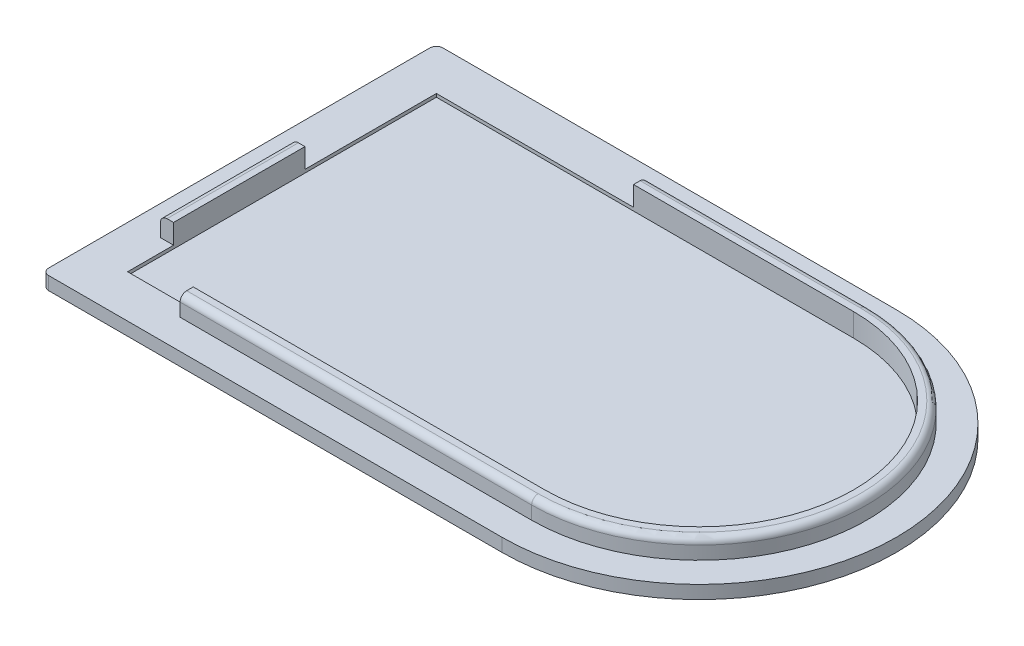
ISO-10303-21;
HEADER;
FILE_DESCRIPTION(('STEP AP214'),'2;1');
FILE_NAME('part.step','',(''),(''),'','','');
FILE_SCHEMA(('AUTOMOTIVE_DESIGN { 1 0 10303 214 1 1 1 1 }'));
ENDSEC;
DATA;
#1=APPLICATION_CONTEXT('core data for automotive mechanical design processes');
#2=APPLICATION_PROTOCOL_DEFINITION('international standard','automotive_design',2000,#1);
#3=PRODUCT_CONTEXT('',#1,'mechanical');
#4=PRODUCT('Part','Part','',(#3));
#5=PRODUCT_RELATED_PRODUCT_CATEGORY('part','',(#4));
#6=PRODUCT_DEFINITION_FORMATION('','',#4);
#7=PRODUCT_DEFINITION_CONTEXT('part definition',#1,'design');
#8=PRODUCT_DEFINITION('design','',#6,#7);
#9=PRODUCT_DEFINITION_SHAPE('','',#8);
#10=(LENGTH_UNIT() NAMED_UNIT(*) SI_UNIT(.MILLI.,.METRE.));
#11=(NAMED_UNIT(*) PLANE_ANGLE_UNIT() SI_UNIT($,.RADIAN.));
#12=(NAMED_UNIT(*) SI_UNIT($,.STERADIAN.) SOLID_ANGLE_UNIT());
#13=UNCERTAINTY_MEASURE_WITH_UNIT(LENGTH_MEASURE(1.E-05),#10,'distance_accuracy_value','');
#14=(GEOMETRIC_REPRESENTATION_CONTEXT(3) GLOBAL_UNCERTAINTY_ASSIGNED_CONTEXT((#13)) GLOBAL_UNIT_ASSIGNED_CONTEXT((#10,
#11,#12)) REPRESENTATION_CONTEXT('',''));
#15=CARTESIAN_POINT('',(0.,0.,0.));
#16=DIRECTION('',(0.,0.,1.));
#17=DIRECTION('',(1.,0.,0.));
#18=AXIS2_PLACEMENT_3D('',#15,#16,#17);
#19=CARTESIAN_POINT('',(0.,3.,-25.5));
#20=DIRECTION('',(0.,0.,1.));
#21=DIRECTION('',(1.,0.,0.));
#22=AXIS2_PLACEMENT_3D('',#19,#20,#21);
#23=PLANE('',#22);
#24=DIRECTION('',(0.,1.,0.));
#25=VECTOR('',#24,1.);
#26=CARTESIAN_POINT('',(-33.5,-38.8329756778952,-25.5));
#27=LINE('',#26,#25);
#28=CARTESIAN_POINT('',(-33.5,0.,-25.5));
#29=VERTEX_POINT('',#28);
#30=CARTESIAN_POINT('',(-33.5,2.,-25.5));
#31=VERTEX_POINT('',#30);
#32=EDGE_CURVE('E359',#29,#31,#27,.T.);
#33=ORIENTED_EDGE('',*,*,#32,.T.);
#34=DIRECTION('',(-1.,0.,0.));
#35=VECTOR('',#34,1.);
#36=CARTESIAN_POINT('',(0.,2.,-25.5));
#37=LINE('',#36,#35);
#38=CARTESIAN_POINT('',(0.,2.,-25.5));
#39=VERTEX_POINT('',#38);
#40=EDGE_CURVE('E339',#31,#39,#37,.F.);
#41=ORIENTED_EDGE('',*,*,#40,.T.);
#42=DIRECTION('',(0.,-1.,0.));
#43=VECTOR('',#42,1.);
#44=CARTESIAN_POINT('',(0.,3.,-25.5));
#45=LINE('',#44,#43);
#46=CARTESIAN_POINT('',(0.,0.,-25.5));
#47=VERTEX_POINT('',#46);
#48=EDGE_CURVE('E254',#39,#47,#45,.T.);
#49=ORIENTED_EDGE('',*,*,#48,.T.);
#50=DIRECTION('',(-1.,0.,0.));
#51=VECTOR('',#50,1.);
#52=CARTESIAN_POINT('',(0.,0.,-25.5));
#53=LINE('',#52,#51);
#54=EDGE_CURVE('E255',#47,#29,#53,.T.);
#55=ORIENTED_EDGE('',*,*,#54,.T.);
#56=EDGE_LOOP('',(#33,#41,#49,#55));
#57=FACE_BOUND('',#56,.T.);
#58=ADVANCED_FACE('F64',(#57),#23,.F.);
#59=CARTESIAN_POINT('',(-65.5,3.,0.));
#60=DIRECTION('',(1.,0.,0.));
#61=DIRECTION('',(0.,0.,-1.));
#62=AXIS2_PLACEMENT_3D('',#59,#60,#61);
#63=PLANE('',#62);
#64=DIRECTION('',(0.,1.,0.));
#65=VECTOR('',#64,1.);
#66=CARTESIAN_POINT('',(-65.5,-38.8329756778952,16.5));
#67=LINE('',#66,#65);
#68=CARTESIAN_POINT('',(-65.5,0.,16.5));
#69=VERTEX_POINT('',#68);
#70=CARTESIAN_POINT('',(-65.5,2.,16.5));
#71=VERTEX_POINT('',#70);
#72=EDGE_CURVE('E221',#69,#71,#67,.T.);
#73=ORIENTED_EDGE('',*,*,#72,.T.);
#74=DIRECTION('',(0.,0.,1.));
#75=VECTOR('',#74,1.);
#76=CARTESIAN_POINT('',(-65.5,2.,-3.49999999999999));
#77=LINE('',#76,#75);
#78=CARTESIAN_POINT('',(-65.5,2.,-3.49999999999999));
#79=VERTEX_POINT('',#78);
#80=EDGE_CURVE('E320',#71,#79,#77,.F.);
#81=ORIENTED_EDGE('',*,*,#80,.T.);
#82=DIRECTION('',(0.,1.,0.));
#83=VECTOR('',#82,1.);
#84=CARTESIAN_POINT('',(-65.5,-38.8329756778952,-3.49999999999999));
#85=LINE('',#84,#83);
#86=CARTESIAN_POINT('',(-65.5,0.,-3.49999999999999));
#87=VERTEX_POINT('',#86);
#88=EDGE_CURVE('E252',#87,#79,#85,.T.);
#89=ORIENTED_EDGE('',*,*,#88,.F.);
#90=DIRECTION('',(0.,0.,1.));
#91=VECTOR('',#90,1.);
#92=CARTESIAN_POINT('',(-65.5,0.,0.));
#93=LINE('',#92,#91);
#94=EDGE_CURVE('E241',#87,#69,#93,.T.);
#95=ORIENTED_EDGE('',*,*,#94,.T.);
#96=EDGE_LOOP('',(#73,#81,#89,#95));
#97=FACE_BOUND('',#96,.T.);
#98=ADVANCED_FACE('F250',(#97),#63,.F.);
#99=CARTESIAN_POINT('',(0.,3.,0.));
#100=DIRECTION('',(0.,1.,0.));
#101=DIRECTION('',(0.,0.,1.));
#102=AXIS2_PLACEMENT_3D('',#99,#100,#101);
#103=PLANE('',#102);
#104=DIRECTION('',(1.,0.,0.));
#105=VECTOR('',#104,1.);
#106=CARTESIAN_POINT('',(-65.5,3.,-3.49999999999999));
#107=LINE('',#106,#105);
#108=CARTESIAN_POINT('',(-64.5,3.,-3.49999999999999));
#109=VERTEX_POINT('',#108);
#110=CARTESIAN_POINT('',(-63.5,3.,-3.49999999999999));
#111=VERTEX_POINT('',#110);
#112=EDGE_CURVE('E371',#109,#111,#107,.T.);
#113=ORIENTED_EDGE('',*,*,#112,.F.);
#114=DIRECTION('',(0.,0.,1.));
#115=VECTOR('',#114,1.);
#116=CARTESIAN_POINT('',(-64.5,3.,16.5));
#117=LINE('',#116,#115);
#118=CARTESIAN_POINT('',(-64.5,3.,16.5));
#119=VERTEX_POINT('',#118);
#120=EDGE_CURVE('E314',#109,#119,#117,.T.);
#121=ORIENTED_EDGE('',*,*,#120,.T.);
#122=DIRECTION('',(1.,0.,0.));
#123=VECTOR('',#122,1.);
#124=CARTESIAN_POINT('',(0.,3.,16.5));
#125=LINE('',#124,#123);
#126=CARTESIAN_POINT('',(-63.5,3.,16.5));
#127=VERTEX_POINT('',#126);
#128=EDGE_CURVE('E233',#119,#127,#125,.T.);
#129=ORIENTED_EDGE('',*,*,#128,.T.);
#130=DIRECTION('',(0.,0.,1.));
#131=VECTOR('',#130,1.);
#132=CARTESIAN_POINT('',(-63.5,3.,0.));
#133=LINE('',#132,#131);
#134=EDGE_CURVE('E389',#111,#127,#133,.T.);
#135=ORIENTED_EDGE('',*,*,#134,.F.);
#136=EDGE_LOOP('',(#113,#121,#129,#135));
#137=FACE_BOUND('',#136,.T.);
#138=ADVANCED_FACE('F536',(#137),#103,.T.);
#139=CARTESIAN_POINT('',(0.,3.,0.));
#140=DIRECTION('',(0.,1.,0.));
#141=DIRECTION('',(0.,0.,1.));
#142=AXIS2_PLACEMENT_3D('',#139,#140,#141);
#143=CIRCLE('',#142,24.5);
#144=CARTESIAN_POINT('',(0.,3.,24.5));
#145=VERTEX_POINT('',#144);
#146=CARTESIAN_POINT('',(0.,3.,-24.5));
#147=VERTEX_POINT('',#146);
#148=EDGE_CURVE('E329',#145,#147,#143,.T.);
#149=ORIENTED_EDGE('',*,*,#148,.T.);
#150=DIRECTION('',(-1.,0.,0.));
#151=VECTOR('',#150,1.);
#152=CARTESIAN_POINT('',(-33.5,3.,-24.5));
#153=LINE('',#152,#151);
#154=CARTESIAN_POINT('',(-33.5,3.,-24.5));
#155=VERTEX_POINT('',#154);
#156=EDGE_CURVE('E332',#147,#155,#153,.T.);
#157=ORIENTED_EDGE('',*,*,#156,.T.);
#158=DIRECTION('',(0.,0.,1.));
#159=VECTOR('',#158,1.);
#160=CARTESIAN_POINT('',(-33.5,3.,-25.5));
#161=LINE('',#160,#159);
#162=CARTESIAN_POINT('',(-33.5,3.,-23.5));
#163=VERTEX_POINT('',#162);
#164=EDGE_CURVE('E354',#155,#163,#161,.T.);
#165=ORIENTED_EDGE('',*,*,#164,.T.);
#166=DIRECTION('',(1.,0.,0.));
#167=VECTOR('',#166,1.);
#168=CARTESIAN_POINT('',(0.,3.,-23.5));
#169=LINE('',#168,#167);
#170=CARTESIAN_POINT('',(2.57661116129768E-13,3.,-23.5));
#171=VERTEX_POINT('',#170);
#172=EDGE_CURVE('E407',#163,#171,#169,.T.);
#173=ORIENTED_EDGE('',*,*,#172,.T.);
#174=CARTESIAN_POINT('',(0.,3.,0.));
#175=DIRECTION('',(0.,1.,0.));
#176=DIRECTION('',(0.,0.,1.));
#177=AXIS2_PLACEMENT_3D('',#174,#175,#176);
#178=CIRCLE('',#177,23.5);
#179=CARTESIAN_POINT('',(0.,3.,23.5));
#180=VERTEX_POINT('',#179);
#181=EDGE_CURVE('E403',#180,#171,#178,.T.);
#182=ORIENTED_EDGE('',*,*,#181,.F.);
#183=DIRECTION('',(1.,0.,0.));
#184=VECTOR('',#183,1.);
#185=CARTESIAN_POINT('',(0.,3.,23.5));
#186=LINE('',#185,#184);
#187=CARTESIAN_POINT('',(-53.5,3.,23.5));
#188=VERTEX_POINT('',#187);
#189=EDGE_CURVE('E383',#188,#180,#186,.T.);
#190=ORIENTED_EDGE('',*,*,#189,.F.);
#191=DIRECTION('',(0.,0.,-1.));
#192=VECTOR('',#191,1.);
#193=CARTESIAN_POINT('',(-53.5,3.,0.));
#194=LINE('',#193,#192);
#195=CARTESIAN_POINT('',(-53.5,3.,24.5));
#196=VERTEX_POINT('',#195);
#197=EDGE_CURVE('E246',#196,#188,#194,.T.);
#198=ORIENTED_EDGE('',*,*,#197,.F.);
#199=DIRECTION('',(-1.,0.,0.));
#200=VECTOR('',#199,1.);
#201=CARTESIAN_POINT('',(0.,3.,24.5));
#202=LINE('',#201,#200);
#203=EDGE_CURVE('E326',#196,#145,#202,.F.);
#204=ORIENTED_EDGE('',*,*,#203,.T.);
#205=EDGE_LOOP('',(#149,#157,#165,#173,#182,#190,#198,#204));
#206=FACE_BOUND('',#205,.T.);
#207=ADVANCED_FACE('F503',(#206),#103,.T.);
#208=CARTESIAN_POINT('',(0.,-0.5,-23.5));
#209=DIRECTION('',(0.,0.,1.));
#210=DIRECTION('',(1.,0.,0.));
#211=AXIS2_PLACEMENT_3D('',#208,#209,#210);
#212=PLANE('',#211);
#213=ORIENTED_EDGE('',*,*,#172,.F.);
#214=DIRECTION('',(0.,-1.,0.));
#215=VECTOR('',#214,1.);
#216=CARTESIAN_POINT('',(-33.5,-0.5,-23.5));
#217=LINE('',#216,#215);
#218=CARTESIAN_POINT('',(-33.5,0.,-23.5));
#219=VERTEX_POINT('',#218);
#220=EDGE_CURVE('E297',#163,#219,#217,.T.);
#221=ORIENTED_EDGE('',*,*,#220,.T.);
#222=DIRECTION('',(1.,0.,0.));
#223=VECTOR('',#222,1.);
#224=CARTESIAN_POINT('',(0.,0.,-23.5));
#225=LINE('',#224,#223);
#226=CARTESIAN_POINT('',(-63.5,0.,-23.5));
#227=VERTEX_POINT('',#226);
#228=EDGE_CURVE('E294',#227,#219,#225,.T.);
#229=ORIENTED_EDGE('',*,*,#228,.F.);
#230=DIRECTION('',(0.,1.,0.));
#231=VECTOR('',#230,1.);
#232=CARTESIAN_POINT('',(-63.5,-0.5,-23.5));
#233=LINE('',#232,#231);
#234=CARTESIAN_POINT('',(-63.5,-0.5,-23.5));
#235=VERTEX_POINT('',#234);
#236=EDGE_CURVE('E418',#235,#227,#233,.T.);
#237=ORIENTED_EDGE('',*,*,#236,.F.);
#238=DIRECTION('',(1.,0.,0.));
#239=VECTOR('',#238,1.);
#240=CARTESIAN_POINT('',(0.,-0.5,-23.5));
#241=LINE('',#240,#239);
#242=CARTESIAN_POINT('',(2.57661116129768E-13,-0.5,-23.5));
#243=VERTEX_POINT('',#242);
#244=EDGE_CURVE('E393',#235,#243,#241,.T.);
#245=ORIENTED_EDGE('',*,*,#244,.T.);
#246=DIRECTION('',(0.,1.,0.));
#247=VECTOR('',#246,1.);
#248=CARTESIAN_POINT('',(2.57661116129768E-13,-0.5,-23.5));
#249=LINE('',#248,#247);
#250=EDGE_CURVE('E422',#243,#171,#249,.T.);
#251=ORIENTED_EDGE('',*,*,#250,.T.);
#252=EDGE_LOOP('',(#213,#221,#229,#237,#245,#251));
#253=FACE_BOUND('',#252,.T.);
#254=ADVANCED_FACE('F494',(#253),#212,.T.);
#255=CARTESIAN_POINT('',(0.,3.,25.5));
#256=DIRECTION('',(0.,0.,1.));
#257=DIRECTION('',(1.,0.,0.));
#258=AXIS2_PLACEMENT_3D('',#255,#256,#257);
#259=PLANE('',#258);
#260=DIRECTION('',(0.,-1.,0.));
#261=VECTOR('',#260,1.);
#262=CARTESIAN_POINT('',(0.,3.,25.5));
#263=LINE('',#262,#261);
#264=CARTESIAN_POINT('',(0.,2.,25.5));
#265=VERTEX_POINT('',#264);
#266=CARTESIAN_POINT('',(0.,0.,25.5));
#267=VERTEX_POINT('',#266);
#268=EDGE_CURVE('E259',#265,#267,#263,.T.);
#269=ORIENTED_EDGE('',*,*,#268,.F.);
#270=DIRECTION('',(-1.,0.,0.));
#271=VECTOR('',#270,1.);
#272=CARTESIAN_POINT('',(0.,2.,25.5));
#273=LINE('',#272,#271);
#274=CARTESIAN_POINT('',(-53.5,2.,25.5));
#275=VERTEX_POINT('',#274);
#276=EDGE_CURVE('E74',#265,#275,#273,.T.);
#277=ORIENTED_EDGE('',*,*,#276,.T.);
#278=DIRECTION('',(0.,1.,0.));
#279=VECTOR('',#278,1.);
#280=CARTESIAN_POINT('',(-53.5,-38.8329756778952,25.5));
#281=LINE('',#280,#279);
#282=CARTESIAN_POINT('',(-53.5,0.,25.5));
#283=VERTEX_POINT('',#282);
#284=EDGE_CURVE('E379',#283,#275,#281,.T.);
#285=ORIENTED_EDGE('',*,*,#284,.F.);
#286=DIRECTION('',(-1.,0.,0.));
#287=VECTOR('',#286,1.);
#288=CARTESIAN_POINT('',(0.,0.,25.5));
#289=LINE('',#288,#287);
#290=EDGE_CURVE('E464',#267,#283,#289,.T.);
#291=ORIENTED_EDGE('',*,*,#290,.F.);
#292=EDGE_LOOP('',(#269,#277,#285,#291));
#293=FACE_BOUND('',#292,.T.);
#294=ADVANCED_FACE('F475',(#293),#259,.T.);
#295=CARTESIAN_POINT('',(0.,3.,0.));
#296=DIRECTION('',(0.,-1.,0.));
#297=DIRECTION('',(0.,0.,-1.));
#298=AXIS2_PLACEMENT_3D('',#295,#296,#297);
#299=CYLINDRICAL_SURFACE('',#298,25.5);
#300=ORIENTED_EDGE('',*,*,#48,.F.);
#301=CARTESIAN_POINT('',(0.,2.,0.));
#302=DIRECTION('',(0.,1.,0.));
#303=DIRECTION('',(0.,0.,1.));
#304=AXIS2_PLACEMENT_3D('',#301,#302,#303);
#305=CIRCLE('',#304,25.5);
#306=EDGE_CURVE('E89',#39,#265,#305,.F.);
#307=ORIENTED_EDGE('',*,*,#306,.T.);
#308=ORIENTED_EDGE('',*,*,#268,.T.);
#309=CARTESIAN_POINT('',(0.,0.,0.));
#310=DIRECTION('',(0.,1.,0.));
#311=DIRECTION('',(0.,0.,1.));
#312=AXIS2_PLACEMENT_3D('',#309,#310,#311);
#313=CIRCLE('',#312,25.5);
#314=EDGE_CURVE('E262',#267,#47,#313,.T.);
#315=ORIENTED_EDGE('',*,*,#314,.T.);
#316=EDGE_LOOP('',(#300,#307,#308,#315));
#317=FACE_BOUND('',#316,.T.);
#318=ADVANCED_FACE('F470',(#317),#299,.T.);
#319=CARTESIAN_POINT('',(0.,0.,0.));
#320=DIRECTION('',(0.,-1.,0.));
#321=DIRECTION('',(0.,0.,-1.));
#322=AXIS2_PLACEMENT_3D('',#319,#320,#321);
#323=PLANE('',#322);
#324=ORIENTED_EDGE('',*,*,#94,.F.);
#325=DIRECTION('',(1.,0.,0.));
#326=VECTOR('',#325,1.);
#327=CARTESIAN_POINT('',(-65.5,0.,-3.49999999999999));
#328=LINE('',#327,#326);
#329=CARTESIAN_POINT('',(-63.5,0.,-3.49999999999999));
#330=VERTEX_POINT('',#329);
#331=EDGE_CURVE('E366',#87,#330,#328,.T.);
#332=ORIENTED_EDGE('',*,*,#331,.T.);
#333=DIRECTION('',(0.,0.,1.));
#334=VECTOR('',#333,1.);
#335=CARTESIAN_POINT('',(-63.5,0.,0.));
#336=LINE('',#335,#334);
#337=EDGE_CURVE('E374',#227,#330,#336,.T.);
#338=ORIENTED_EDGE('',*,*,#337,.F.);
#339=ORIENTED_EDGE('',*,*,#228,.T.);
#340=DIRECTION('',(0.,0.,1.));
#341=VECTOR('',#340,1.);
#342=CARTESIAN_POINT('',(-33.5,0.,-25.5));
#343=LINE('',#342,#341);
#344=EDGE_CURVE('E247',#29,#219,#343,.T.);
#345=ORIENTED_EDGE('',*,*,#344,.F.);
#346=ORIENTED_EDGE('',*,*,#54,.F.);
#347=ORIENTED_EDGE('',*,*,#314,.F.);
#348=ORIENTED_EDGE('',*,*,#290,.T.);
#349=DIRECTION('',(0.,0.,-1.));
#350=VECTOR('',#349,1.);
#351=CARTESIAN_POINT('',(-53.5,0.,0.));
#352=LINE('',#351,#350);
#353=CARTESIAN_POINT('',(-53.5,0.,23.5));
#354=VERTEX_POINT('',#353);
#355=EDGE_CURVE('E234',#283,#354,#352,.T.);
#356=ORIENTED_EDGE('',*,*,#355,.T.);
#357=DIRECTION('',(1.,0.,0.));
#358=VECTOR('',#357,1.);
#359=CARTESIAN_POINT('',(0.,0.,23.5));
#360=LINE('',#359,#358);
#361=CARTESIAN_POINT('',(-63.5,0.,23.5));
#362=VERTEX_POINT('',#361);
#363=EDGE_CURVE('E378',#362,#354,#360,.T.);
#364=ORIENTED_EDGE('',*,*,#363,.F.);
#365=DIRECTION('',(0.,0.,1.));
#366=VECTOR('',#365,1.);
#367=CARTESIAN_POINT('',(-63.5,0.,0.));
#368=LINE('',#367,#366);
#369=CARTESIAN_POINT('',(-63.5,0.,16.5));
#370=VERTEX_POINT('',#369);
#371=EDGE_CURVE('E243',#370,#362,#368,.T.);
#372=ORIENTED_EDGE('',*,*,#371,.F.);
#373=DIRECTION('',(1.,0.,0.));
#374=VECTOR('',#373,1.);
#375=CARTESIAN_POINT('',(0.,0.,16.5));
#376=LINE('',#375,#374);
#377=EDGE_CURVE('E226',#69,#370,#376,.T.);
#378=ORIENTED_EDGE('',*,*,#377,.F.);
#379=EDGE_LOOP('',(#324,#332,#338,#339,#345,#346,#347,#348,#356,#364,#372,#378));
#380=FACE_BOUND('',#379,.T.);
#381=DIRECTION('',(1.,0.,0.));
#382=VECTOR('',#381,1.);
#383=CARTESIAN_POINT('',(0.,0.,-30.));
#384=LINE('',#383,#382);
#385=CARTESIAN_POINT('',(-69.,0.,-30.));
#386=VERTEX_POINT('',#385);
#387=CARTESIAN_POINT('',(0.,0.,-30.));
#388=VERTEX_POINT('',#387);
#389=EDGE_CURVE('E417',#386,#388,#384,.T.);
#390=ORIENTED_EDGE('',*,*,#389,.F.);
#391=CARTESIAN_POINT('',(-69.,0.,-29.));
#392=DIRECTION('',(0.,-1.,0.));
#393=DIRECTION('',(0.,0.,-1.));
#394=AXIS2_PLACEMENT_3D('',#391,#392,#393);
#395=CIRCLE('',#394,1.);
#396=CARTESIAN_POINT('',(-70.,0.,-29.));
#397=VERTEX_POINT('',#396);
#398=EDGE_CURVE('E275',#386,#397,#395,.F.);
#399=ORIENTED_EDGE('',*,*,#398,.T.);
#400=DIRECTION('',(0.,0.,-1.));
#401=VECTOR('',#400,1.);
#402=CARTESIAN_POINT('',(-70.,0.,0.));
#403=LINE('',#402,#401);
#404=CARTESIAN_POINT('',(-70.,0.,29.));
#405=VERTEX_POINT('',#404);
#406=EDGE_CURVE('E433',#405,#397,#403,.T.);
#407=ORIENTED_EDGE('',*,*,#406,.F.);
#408=CARTESIAN_POINT('',(-69.,0.,29.));
#409=DIRECTION('',(0.,-1.,0.));
#410=DIRECTION('',(0.,0.,-1.));
#411=AXIS2_PLACEMENT_3D('',#408,#409,#410);
#412=CIRCLE('',#411,1.);
#413=CARTESIAN_POINT('',(-69.,0.,30.));
#414=VERTEX_POINT('',#413);
#415=EDGE_CURVE('E272',#405,#414,#412,.F.);
#416=ORIENTED_EDGE('',*,*,#415,.T.);
#417=DIRECTION('',(1.,0.,0.));
#418=VECTOR('',#417,1.);
#419=CARTESIAN_POINT('',(0.,0.,30.));
#420=LINE('',#419,#418);
#421=CARTESIAN_POINT('',(0.,0.,30.));
#422=VERTEX_POINT('',#421);
#423=EDGE_CURVE('E451',#414,#422,#420,.T.);
#424=ORIENTED_EDGE('',*,*,#423,.T.);
#425=CARTESIAN_POINT('',(0.,0.,0.));
#426=DIRECTION('',(0.,-1.,0.));
#427=DIRECTION('',(0.,0.,-1.));
#428=AXIS2_PLACEMENT_3D('',#425,#426,#427);
#429=CIRCLE('',#428,30.);
#430=EDGE_CURVE('E447',#388,#422,#429,.T.);
#431=ORIENTED_EDGE('',*,*,#430,.F.);
#432=EDGE_LOOP('',(#390,#399,#407,#416,#424,#431));
#433=FACE_BOUND('',#432,.T.);
#434=ADVANCED_FACE('F238',(#380,#433),#323,.F.);
#435=CARTESIAN_POINT('',(0.,-2.,-30.));
#436=DIRECTION('',(0.,0.,1.));
#437=DIRECTION('',(1.,0.,0.));
#438=AXIS2_PLACEMENT_3D('',#435,#436,#437);
#439=PLANE('',#438);
#440=DIRECTION('',(1.,0.,0.));
#441=VECTOR('',#440,1.);
#442=CARTESIAN_POINT('',(0.,-2.,-30.));
#443=LINE('',#442,#441);
#444=CARTESIAN_POINT('',(-69.,-2.,-30.));
#445=VERTEX_POINT('',#444);
#446=CARTESIAN_POINT('',(0.,-2.,-30.));
#447=VERTEX_POINT('',#446);
#448=EDGE_CURVE('E429',#445,#447,#443,.T.);
#449=ORIENTED_EDGE('',*,*,#448,.F.);
#450=DIRECTION('',(0.,1.,0.));
#451=VECTOR('',#450,1.);
#452=CARTESIAN_POINT('',(-69.,-2.,-30.));
#453=LINE('',#452,#451);
#454=EDGE_CURVE('E268',#445,#386,#453,.T.);
#455=ORIENTED_EDGE('',*,*,#454,.T.);
#456=ORIENTED_EDGE('',*,*,#389,.T.);
#457=DIRECTION('',(0.,1.,0.));
#458=VECTOR('',#457,1.);
#459=CARTESIAN_POINT('',(0.,-2.,-30.));
#460=LINE('',#459,#458);
#461=EDGE_CURVE('E460',#447,#388,#460,.T.);
#462=ORIENTED_EDGE('',*,*,#461,.F.);
#463=EDGE_LOOP('',(#449,#455,#456,#462));
#464=FACE_BOUND('',#463,.T.);
#465=ADVANCED_FACE('F567',(#464),#439,.F.);
#466=CARTESIAN_POINT('',(0.,-2.,0.));
#467=DIRECTION('',(0.,1.,0.));
#468=DIRECTION('',(0.,0.,1.));
#469=AXIS2_PLACEMENT_3D('',#466,#467,#468);
#470=CYLINDRICAL_SURFACE('',#469,30.);
#471=ORIENTED_EDGE('',*,*,#430,.T.);
#472=DIRECTION('',(0.,1.,0.));
#473=VECTOR('',#472,1.);
#474=CARTESIAN_POINT('',(0.,-2.,30.));
#475=LINE('',#474,#473);
#476=CARTESIAN_POINT('',(0.,-2.,30.));
#477=VERTEX_POINT('',#476);
#478=EDGE_CURVE('E444',#477,#422,#475,.T.);
#479=ORIENTED_EDGE('',*,*,#478,.F.);
#480=CARTESIAN_POINT('',(0.,-2.,0.));
#481=DIRECTION('',(0.,-1.,0.));
#482=DIRECTION('',(0.,0.,-1.));
#483=AXIS2_PLACEMENT_3D('',#480,#481,#482);
#484=CIRCLE('',#483,30.);
#485=EDGE_CURVE('E432',#447,#477,#484,.T.);
#486=ORIENTED_EDGE('',*,*,#485,.F.);
#487=ORIENTED_EDGE('',*,*,#461,.T.);
#488=EDGE_LOOP('',(#471,#479,#486,#487));
#489=FACE_BOUND('',#488,.T.);
#490=ADVANCED_FACE('F570',(#489),#470,.T.);
#491=CARTESIAN_POINT('',(0.,-2.,30.));
#492=DIRECTION('',(0.,0.,1.));
#493=DIRECTION('',(1.,0.,0.));
#494=AXIS2_PLACEMENT_3D('',#491,#492,#493);
#495=PLANE('',#494);
#496=ORIENTED_EDGE('',*,*,#423,.F.);
#497=DIRECTION('',(0.,1.,0.));
#498=VECTOR('',#497,1.);
#499=CARTESIAN_POINT('',(-69.,-2.,30.));
#500=LINE('',#499,#498);
#501=CARTESIAN_POINT('',(-69.,-2.,30.));
#502=VERTEX_POINT('',#501);
#503=EDGE_CURVE('E291',#414,#502,#500,.F.);
#504=ORIENTED_EDGE('',*,*,#503,.T.);
#505=DIRECTION('',(1.,0.,0.));
#506=VECTOR('',#505,1.);
#507=CARTESIAN_POINT('',(0.,-2.,30.));
#508=LINE('',#507,#506);
#509=EDGE_CURVE('E437',#502,#477,#508,.T.);
#510=ORIENTED_EDGE('',*,*,#509,.T.);
#511=ORIENTED_EDGE('',*,*,#478,.T.);
#512=EDGE_LOOP('',(#496,#504,#510,#511));
#513=FACE_BOUND('',#512,.T.);
#514=ADVANCED_FACE('F574',(#513),#495,.T.);
#515=CARTESIAN_POINT('',(-70.,-2.,0.));
#516=DIRECTION('',(1.,0.,0.));
#517=DIRECTION('',(0.,0.,-1.));
#518=AXIS2_PLACEMENT_3D('',#515,#516,#517);
#519=PLANE('',#518);
#520=ORIENTED_EDGE('',*,*,#406,.T.);
#521=DIRECTION('',(0.,1.,0.));
#522=VECTOR('',#521,1.);
#523=CARTESIAN_POINT('',(-70.,-2.,-29.));
#524=LINE('',#523,#522);
#525=CARTESIAN_POINT('',(-70.,-2.,-29.));
#526=VERTEX_POINT('',#525);
#527=EDGE_CURVE('E282',#397,#526,#524,.F.);
#528=ORIENTED_EDGE('',*,*,#527,.T.);
#529=DIRECTION('',(0.,0.,-1.));
#530=VECTOR('',#529,1.);
#531=CARTESIAN_POINT('',(-70.,-2.,0.));
#532=LINE('',#531,#530);
#533=CARTESIAN_POINT('',(-70.,-2.,29.));
#534=VERTEX_POINT('',#533);
#535=EDGE_CURVE('E440',#534,#526,#532,.T.);
#536=ORIENTED_EDGE('',*,*,#535,.F.);
#537=DIRECTION('',(0.,1.,0.));
#538=VECTOR('',#537,1.);
#539=CARTESIAN_POINT('',(-70.,0.,29.));
#540=LINE('',#539,#538);
#541=EDGE_CURVE('E278',#534,#405,#540,.T.);
#542=ORIENTED_EDGE('',*,*,#541,.T.);
#543=EDGE_LOOP('',(#520,#528,#536,#542));
#544=FACE_BOUND('',#543,.T.);
#545=ADVANCED_FACE('F578',(#544),#519,.F.);
#546=CARTESIAN_POINT('',(0.,-2.,0.));
#547=DIRECTION('',(0.,-1.,0.));
#548=DIRECTION('',(0.,0.,-1.));
#549=AXIS2_PLACEMENT_3D('',#546,#547,#548);
#550=PLANE('',#549);
#551=ORIENTED_EDGE('',*,*,#535,.T.);
#552=CARTESIAN_POINT('',(-69.,-2.,-29.));
#553=DIRECTION('',(0.,-1.,0.));
#554=DIRECTION('',(0.,0.,-1.));
#555=AXIS2_PLACEMENT_3D('',#552,#553,#554);
#556=CIRCLE('',#555,1.);
#557=EDGE_CURVE('E288',#526,#445,#556,.T.);
#558=ORIENTED_EDGE('',*,*,#557,.T.);
#559=ORIENTED_EDGE('',*,*,#448,.T.);
#560=ORIENTED_EDGE('',*,*,#485,.T.);
#561=ORIENTED_EDGE('',*,*,#509,.F.);
#562=CARTESIAN_POINT('',(-69.,-2.,29.));
#563=DIRECTION('',(0.,-1.,0.));
#564=DIRECTION('',(0.,0.,-1.));
#565=AXIS2_PLACEMENT_3D('',#562,#563,#564);
#566=CIRCLE('',#565,1.);
#567=EDGE_CURVE('E285',#502,#534,#566,.T.);
#568=ORIENTED_EDGE('',*,*,#567,.T.);
#569=EDGE_LOOP('',(#551,#558,#559,#560,#561,#568));
#570=FACE_BOUND('',#569,.T.);
#571=ADVANCED_FACE('F582',(#570),#550,.T.);
#572=CARTESIAN_POINT('',(0.,-0.5,23.5));
#573=DIRECTION('',(0.,0.,1.));
#574=DIRECTION('',(1.,0.,0.));
#575=AXIS2_PLACEMENT_3D('',#572,#573,#574);
#576=PLANE('',#575);
#577=DIRECTION('',(0.,1.,0.));
#578=VECTOR('',#577,1.);
#579=CARTESIAN_POINT('',(-63.5,-0.5,23.5));
#580=LINE('',#579,#578);
#581=CARTESIAN_POINT('',(-63.5,-0.5,23.5));
#582=VERTEX_POINT('',#581);
#583=EDGE_CURVE('E413',#582,#362,#580,.T.);
#584=ORIENTED_EDGE('',*,*,#583,.T.);
#585=ORIENTED_EDGE('',*,*,#363,.T.);
#586=DIRECTION('',(0.,1.,0.));
#587=VECTOR('',#586,1.);
#588=CARTESIAN_POINT('',(-53.5,-0.5,23.5));
#589=LINE('',#588,#587);
#590=EDGE_CURVE('E310',#354,#188,#589,.T.);
#591=ORIENTED_EDGE('',*,*,#590,.T.);
#592=ORIENTED_EDGE('',*,*,#189,.T.);
#593=DIRECTION('',(0.,1.,0.));
#594=VECTOR('',#593,1.);
#595=CARTESIAN_POINT('',(2.63677968348475E-13,-0.5,23.5));
#596=LINE('',#595,#594);
#597=CARTESIAN_POINT('',(2.63677968348475E-13,-0.5,23.5));
#598=VERTEX_POINT('',#597);
#599=EDGE_CURVE('E400',#598,#180,#596,.T.);
#600=ORIENTED_EDGE('',*,*,#599,.F.);
#601=DIRECTION('',(1.,0.,0.));
#602=VECTOR('',#601,1.);
#603=CARTESIAN_POINT('',(0.,-0.5,23.5));
#604=LINE('',#603,#602);
#605=EDGE_CURVE('E384',#582,#598,#604,.T.);
#606=ORIENTED_EDGE('',*,*,#605,.F.);
#607=EDGE_LOOP('',(#584,#585,#591,#592,#600,#606));
#608=FACE_BOUND('',#607,.T.);
#609=ADVANCED_FACE('F508',(#608),#576,.F.);
#610=CARTESIAN_POINT('',(-63.5,-0.5,0.));
#611=DIRECTION('',(-1.,0.,0.));
#612=DIRECTION('',(0.,0.,1.));
#613=AXIS2_PLACEMENT_3D('',#610,#611,#612);
#614=PLANE('',#613);
#615=DIRECTION('',(0.,1.,0.));
#616=VECTOR('',#615,1.);
#617=CARTESIAN_POINT('',(-63.5,-0.5,16.5));
#618=LINE('',#617,#616);
#619=EDGE_CURVE('E305',#370,#127,#618,.T.);
#620=ORIENTED_EDGE('',*,*,#619,.F.);
#621=ORIENTED_EDGE('',*,*,#371,.T.);
#622=ORIENTED_EDGE('',*,*,#583,.F.);
#623=DIRECTION('',(0.,0.,1.));
#624=VECTOR('',#623,1.);
#625=CARTESIAN_POINT('',(-63.5,-0.5,0.));
#626=LINE('',#625,#624);
#627=EDGE_CURVE('E396',#235,#582,#626,.T.);
#628=ORIENTED_EDGE('',*,*,#627,.F.);
#629=ORIENTED_EDGE('',*,*,#236,.T.);
#630=ORIENTED_EDGE('',*,*,#337,.T.);
#631=DIRECTION('',(0.,1.,0.));
#632=VECTOR('',#631,1.);
#633=CARTESIAN_POINT('',(-63.5,-0.5,-3.49999999999999));
#634=LINE('',#633,#632);
#635=EDGE_CURVE('E301',#330,#111,#634,.T.);
#636=ORIENTED_EDGE('',*,*,#635,.T.);
#637=ORIENTED_EDGE('',*,*,#134,.T.);
#638=EDGE_LOOP('',(#620,#621,#622,#628,#629,#630,#636,#637));
#639=FACE_BOUND('',#638,.T.);
#640=ADVANCED_FACE('F488',(#639),#614,.F.);
#641=CARTESIAN_POINT('',(0.,-0.5,0.));
#642=DIRECTION('',(0.,1.,0.));
#643=DIRECTION('',(0.,0.,1.));
#644=AXIS2_PLACEMENT_3D('',#641,#642,#643);
#645=CYLINDRICAL_SURFACE('',#644,23.5);
#646=ORIENTED_EDGE('',*,*,#181,.T.);
#647=ORIENTED_EDGE('',*,*,#250,.F.);
#648=CARTESIAN_POINT('',(0.,-0.5,0.));
#649=DIRECTION('',(0.,1.,0.));
#650=DIRECTION('',(0.,0.,1.));
#651=AXIS2_PLACEMENT_3D('',#648,#649,#650);
#652=CIRCLE('',#651,23.5);
#653=EDGE_CURVE('E388',#598,#243,#652,.T.);
#654=ORIENTED_EDGE('',*,*,#653,.F.);
#655=ORIENTED_EDGE('',*,*,#599,.T.);
#656=EDGE_LOOP('',(#646,#647,#654,#655));
#657=FACE_BOUND('',#656,.T.);
#658=ADVANCED_FACE('F501',(#657),#645,.F.);
#659=CARTESIAN_POINT('',(0.,-0.5,0.));
#660=DIRECTION('',(0.,1.,0.));
#661=DIRECTION('',(0.,0.,1.));
#662=AXIS2_PLACEMENT_3D('',#659,#660,#661);
#663=PLANE('',#662);
#664=ORIENTED_EDGE('',*,*,#605,.T.);
#665=ORIENTED_EDGE('',*,*,#653,.T.);
#666=ORIENTED_EDGE('',*,*,#244,.F.);
#667=ORIENTED_EDGE('',*,*,#627,.T.);
#668=EDGE_LOOP('',(#664,#665,#666,#667));
#669=FACE_BOUND('',#668,.T.);
#670=ADVANCED_FACE('F497',(#669),#663,.T.);
#671=CARTESIAN_POINT('',(-69.,-2.,-29.));
#672=DIRECTION('',(0.,1.,0.));
#673=DIRECTION('',(0.,0.,1.));
#674=AXIS2_PLACEMENT_3D('',#671,#672,#673);
#675=CYLINDRICAL_SURFACE('',#674,1.);
#676=ORIENTED_EDGE('',*,*,#557,.F.);
#677=ORIENTED_EDGE('',*,*,#527,.F.);
#678=ORIENTED_EDGE('',*,*,#398,.F.);
#679=ORIENTED_EDGE('',*,*,#454,.F.);
#680=EDGE_LOOP('',(#676,#677,#678,#679));
#681=FACE_BOUND('',#680,.T.);
#682=ADVANCED_FACE('F544',(#681),#675,.T.);
#683=CARTESIAN_POINT('',(-69.,-2.,29.));
#684=DIRECTION('',(0.,-1.,0.));
#685=DIRECTION('',(0.,0.,-1.));
#686=AXIS2_PLACEMENT_3D('',#683,#684,#685);
#687=CYLINDRICAL_SURFACE('',#686,1.);
#688=ORIENTED_EDGE('',*,*,#567,.F.);
#689=ORIENTED_EDGE('',*,*,#503,.F.);
#690=ORIENTED_EDGE('',*,*,#415,.F.);
#691=ORIENTED_EDGE('',*,*,#541,.F.);
#692=EDGE_LOOP('',(#688,#689,#690,#691));
#693=FACE_BOUND('',#692,.T.);
#694=ADVANCED_FACE('F547',(#693),#687,.T.);
#695=CARTESIAN_POINT('',(0.,-38.8329756778952,-3.49999999999999));
#696=DIRECTION('',(0.,0.,1.));
#697=DIRECTION('',(1.,0.,0.));
#698=AXIS2_PLACEMENT_3D('',#695,#696,#697);
#699=PLANE('',#698);
#700=ORIENTED_EDGE('',*,*,#88,.T.);
#701=CARTESIAN_POINT('',(-64.5,2.,-3.49999999999999));
#702=DIRECTION('',(0.,0.,1.));
#703=DIRECTION('',(1.,0.,0.));
#704=AXIS2_PLACEMENT_3D('',#701,#702,#703);
#705=CIRCLE('',#704,1.);
#706=EDGE_CURVE('E323',#79,#109,#705,.F.);
#707=ORIENTED_EDGE('',*,*,#706,.T.);
#708=ORIENTED_EDGE('',*,*,#112,.T.);
#709=ORIENTED_EDGE('',*,*,#635,.F.);
#710=ORIENTED_EDGE('',*,*,#331,.F.);
#711=EDGE_LOOP('',(#700,#707,#708,#709,#710));
#712=FACE_BOUND('',#711,.T.);
#713=ADVANCED_FACE('F551',(#712),#699,.F.);
#714=CARTESIAN_POINT('',(-33.5,-38.8329756778952,0.));
#715=DIRECTION('',(-1.,0.,0.));
#716=DIRECTION('',(0.,0.,1.));
#717=AXIS2_PLACEMENT_3D('',#714,#715,#716);
#718=PLANE('',#717);
#719=ORIENTED_EDGE('',*,*,#164,.F.);
#720=CARTESIAN_POINT('',(-33.5,2.,-24.5));
#721=DIRECTION('',(-1.,0.,0.));
#722=DIRECTION('',(0.,0.,1.));
#723=AXIS2_PLACEMENT_3D('',#720,#721,#722);
#724=CIRCLE('',#723,1.);
#725=EDGE_CURVE('E336',#155,#31,#724,.T.);
#726=ORIENTED_EDGE('',*,*,#725,.T.);
#727=ORIENTED_EDGE('',*,*,#32,.F.);
#728=ORIENTED_EDGE('',*,*,#344,.T.);
#729=ORIENTED_EDGE('',*,*,#220,.F.);
#730=EDGE_LOOP('',(#719,#726,#727,#728,#729));
#731=FACE_BOUND('',#730,.T.);
#732=ADVANCED_FACE('F517',(#731),#718,.T.);
#733=CARTESIAN_POINT('',(-53.5,-38.8329756778952,0.));
#734=DIRECTION('',(1.,0.,0.));
#735=DIRECTION('',(0.,0.,-1.));
#736=AXIS2_PLACEMENT_3D('',#733,#734,#735);
#737=PLANE('',#736);
#738=ORIENTED_EDGE('',*,*,#284,.T.);
#739=CARTESIAN_POINT('',(-53.5,2.,24.5));
#740=DIRECTION('',(1.,0.,0.));
#741=DIRECTION('',(0.,0.,-1.));
#742=AXIS2_PLACEMENT_3D('',#739,#740,#741);
#743=CIRCLE('',#742,1.);
#744=EDGE_CURVE('E12',#275,#196,#743,.F.);
#745=ORIENTED_EDGE('',*,*,#744,.T.);
#746=ORIENTED_EDGE('',*,*,#197,.T.);
#747=ORIENTED_EDGE('',*,*,#590,.F.);
#748=ORIENTED_EDGE('',*,*,#355,.F.);
#749=EDGE_LOOP('',(#738,#745,#746,#747,#748));
#750=FACE_BOUND('',#749,.T.);
#751=ADVANCED_FACE('F509',(#750),#737,.F.);
#752=CARTESIAN_POINT('',(0.,-38.8329756778952,16.5));
#753=DIRECTION('',(0.,0.,1.));
#754=DIRECTION('',(1.,0.,0.));
#755=AXIS2_PLACEMENT_3D('',#752,#753,#754);
#756=PLANE('',#755);
#757=ORIENTED_EDGE('',*,*,#128,.F.);
#758=CARTESIAN_POINT('',(-64.5,2.,16.5));
#759=DIRECTION('',(0.,0.,1.));
#760=DIRECTION('',(1.,0.,0.));
#761=AXIS2_PLACEMENT_3D('',#758,#759,#760);
#762=CIRCLE('',#761,1.);
#763=EDGE_CURVE('E228',#119,#71,#762,.T.);
#764=ORIENTED_EDGE('',*,*,#763,.T.);
#765=ORIENTED_EDGE('',*,*,#72,.F.);
#766=ORIENTED_EDGE('',*,*,#377,.T.);
#767=ORIENTED_EDGE('',*,*,#619,.T.);
#768=EDGE_LOOP('',(#757,#764,#765,#766,#767));
#769=FACE_BOUND('',#768,.T.);
#770=ADVANCED_FACE('F224',(#769),#756,.T.);
#771=CARTESIAN_POINT('',(-64.5,2.,0.));
#772=DIRECTION('',(0.,0.,-1.));
#773=DIRECTION('',(-1.,0.,0.));
#774=AXIS2_PLACEMENT_3D('',#771,#772,#773);
#775=CYLINDRICAL_SURFACE('',#774,1.);
#776=ORIENTED_EDGE('',*,*,#706,.F.);
#777=ORIENTED_EDGE('',*,*,#80,.F.);
#778=ORIENTED_EDGE('',*,*,#763,.F.);
#779=ORIENTED_EDGE('',*,*,#120,.F.);
#780=EDGE_LOOP('',(#776,#777,#778,#779));
#781=FACE_BOUND('',#780,.T.);
#782=ADVANCED_FACE('F527',(#781),#775,.T.);
#783=CARTESIAN_POINT('',(0.,2.,24.5));
#784=DIRECTION('',(-1.,0.,0.));
#785=DIRECTION('',(0.,0.,1.));
#786=AXIS2_PLACEMENT_3D('',#783,#784,#785);
#787=CYLINDRICAL_SURFACE('',#786,1.);
#788=ORIENTED_EDGE('',*,*,#744,.F.);
#789=ORIENTED_EDGE('',*,*,#276,.F.);
#790=CARTESIAN_POINT('',(0.,2.,24.5));
#791=DIRECTION('',(1.,0.,0.));
#792=DIRECTION('',(0.,0.,-1.));
#793=AXIS2_PLACEMENT_3D('',#790,#791,#792);
#794=CIRCLE('',#793,1.);
#795=EDGE_CURVE('E68',#145,#265,#794,.T.);
#796=ORIENTED_EDGE('',*,*,#795,.F.);
#797=ORIENTED_EDGE('',*,*,#203,.F.);
#798=EDGE_LOOP('',(#788,#789,#796,#797));
#799=FACE_BOUND('',#798,.T.);
#800=ADVANCED_FACE('F66',(#799),#787,.T.);
#801=CARTESIAN_POINT('',(0.,2.,0.));
#802=DIRECTION('',(0.,1.,0.));
#803=DIRECTION('',(0.,0.,1.));
#804=AXIS2_PLACEMENT_3D('',#801,#802,#803);
#805=TOROIDAL_SURFACE('',#804,24.5,1.);
#806=ORIENTED_EDGE('',*,*,#795,.T.);
#807=ORIENTED_EDGE('',*,*,#306,.F.);
#808=CARTESIAN_POINT('',(0.,2.,-24.5));
#809=DIRECTION('',(-1.,0.,0.));
#810=DIRECTION('',(0.,0.,1.));
#811=AXIS2_PLACEMENT_3D('',#808,#809,#810);
#812=CIRCLE('',#811,1.);
#813=EDGE_CURVE('E345',#147,#39,#812,.T.);
#814=ORIENTED_EDGE('',*,*,#813,.F.);
#815=ORIENTED_EDGE('',*,*,#148,.F.);
#816=EDGE_LOOP('',(#806,#807,#814,#815));
#817=FACE_BOUND('',#816,.T.);
#818=ADVANCED_FACE('F520',(#817),#805,.T.);
#819=CARTESIAN_POINT('',(0.,2.,-24.5));
#820=DIRECTION('',(1.,0.,0.));
#821=DIRECTION('',(0.,0.,-1.));
#822=AXIS2_PLACEMENT_3D('',#819,#820,#821);
#823=CYLINDRICAL_SURFACE('',#822,1.);
#824=ORIENTED_EDGE('',*,*,#813,.T.);
#825=ORIENTED_EDGE('',*,*,#40,.F.);
#826=ORIENTED_EDGE('',*,*,#725,.F.);
#827=ORIENTED_EDGE('',*,*,#156,.F.);
#828=EDGE_LOOP('',(#824,#825,#826,#827));
#829=FACE_BOUND('',#828,.T.);
#830=ADVANCED_FACE('F519',(#829),#823,.T.);
#831=CLOSED_SHELL('',(#58,#98,#138,#207,#254,#294,#318,#434,#465,#490,#514,#545,#571,#609,#640,
#658,#670,#682,#694,#713,#732,#751,#770,#782,#800,#818,#830));
#832=MANIFOLD_SOLID_BREP('B2',#831);
#833=ADVANCED_BREP_SHAPE_REPRESENTATION('',(#18,#832),#14);
#834=SHAPE_DEFINITION_REPRESENTATION(#9,#833);
ENDSEC;
END-ISO-10303-21;
